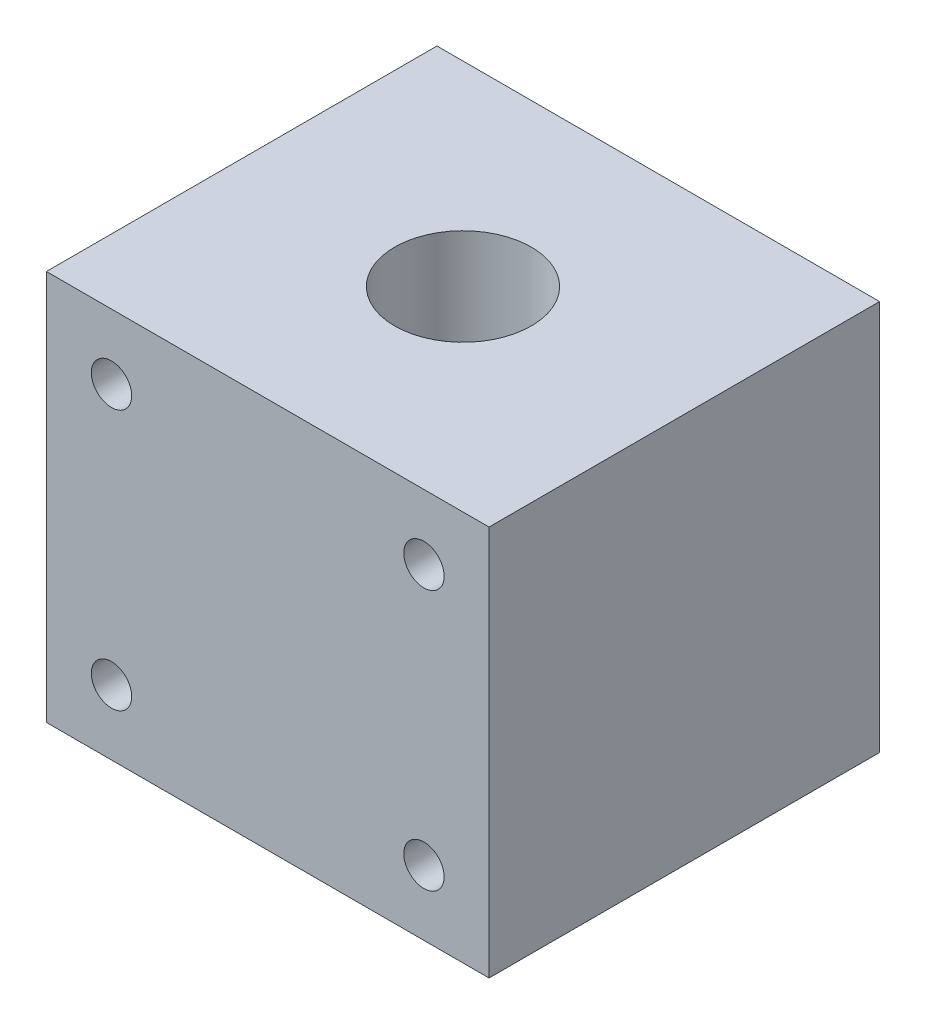
ISO-10303-21;
HEADER;
FILE_DESCRIPTION(('STEP AP214'),'2;1');
FILE_NAME('part.step','',(''),(''),'','','');
FILE_SCHEMA(('AUTOMOTIVE_DESIGN { 1 0 10303 214 1 1 1 1 }'));
ENDSEC;
DATA;
#1=APPLICATION_CONTEXT('core data for automotive mechanical design processes');
#2=APPLICATION_PROTOCOL_DEFINITION('international standard','automotive_design',2000,#1);
#3=PRODUCT_CONTEXT('',#1,'mechanical');
#4=PRODUCT('Part','Part','',(#3));
#5=PRODUCT_RELATED_PRODUCT_CATEGORY('part','',(#4));
#6=PRODUCT_DEFINITION_FORMATION('','',#4);
#7=PRODUCT_DEFINITION_CONTEXT('part definition',#1,'design');
#8=PRODUCT_DEFINITION('design','',#6,#7);
#9=PRODUCT_DEFINITION_SHAPE('','',#8);
#10=(LENGTH_UNIT() NAMED_UNIT(*) SI_UNIT(.MILLI.,.METRE.));
#11=(NAMED_UNIT(*) PLANE_ANGLE_UNIT() SI_UNIT($,.RADIAN.));
#12=(NAMED_UNIT(*) SI_UNIT($,.STERADIAN.) SOLID_ANGLE_UNIT());
#13=UNCERTAINTY_MEASURE_WITH_UNIT(LENGTH_MEASURE(1.E-05),#10,'distance_accuracy_value','');
#14=(GEOMETRIC_REPRESENTATION_CONTEXT(3) GLOBAL_UNCERTAINTY_ASSIGNED_CONTEXT((#13)) GLOBAL_UNIT_ASSIGNED_CONTEXT((#10,
#11,#12)) REPRESENTATION_CONTEXT('',''));
#15=CARTESIAN_POINT('',(0.,0.,0.));
#16=DIRECTION('',(0.,0.,1.));
#17=DIRECTION('',(1.,0.,0.));
#18=AXIS2_PLACEMENT_3D('',#15,#16,#17);
#19=CARTESIAN_POINT('',(0.,30.,0.));
#20=DIRECTION('',(0.,1.,0.));
#21=DIRECTION('',(0.,0.,1.));
#22=AXIS2_PLACEMENT_3D('',#19,#20,#21);
#23=PLANE('',#22);
#24=DIRECTION('',(-1.,0.,0.));
#25=VECTOR('',#24,1.);
#26=CARTESIAN_POINT('',(34.,30.,0.));
#27=LINE('',#26,#25);
#28=CARTESIAN_POINT('',(34.,30.,0.));
#29=VERTEX_POINT('',#28);
#30=CARTESIAN_POINT('',(0.,30.,0.));
#31=VERTEX_POINT('',#30);
#32=EDGE_CURVE('E92',#29,#31,#27,.T.);
#33=ORIENTED_EDGE('',*,*,#32,.T.);
#34=DIRECTION('',(0.,0.,1.));
#35=VECTOR('',#34,1.);
#36=CARTESIAN_POINT('',(0.,30.,0.));
#37=LINE('',#36,#35);
#38=CARTESIAN_POINT('',(0.,30.,30.));
#39=VERTEX_POINT('',#38);
#40=EDGE_CURVE('E87',#31,#39,#37,.T.);
#41=ORIENTED_EDGE('',*,*,#40,.T.);
#42=DIRECTION('',(1.,0.,0.));
#43=VECTOR('',#42,1.);
#44=CARTESIAN_POINT('',(0.,30.,30.));
#45=LINE('',#44,#43);
#46=CARTESIAN_POINT('',(34.,30.,30.));
#47=VERTEX_POINT('',#46);
#48=EDGE_CURVE('E90',#39,#47,#45,.T.);
#49=ORIENTED_EDGE('',*,*,#48,.T.);
#50=DIRECTION('',(0.,0.,-1.));
#51=VECTOR('',#50,1.);
#52=CARTESIAN_POINT('',(34.,30.,30.));
#53=LINE('',#52,#51);
#54=EDGE_CURVE('E57',#47,#29,#53,.T.);
#55=ORIENTED_EDGE('',*,*,#54,.T.);
#56=EDGE_LOOP('',(#33,#41,#49,#55));
#57=FACE_BOUND('',#56,.T.);
#58=CARTESIAN_POINT('',(17.,30.,15.));
#59=DIRECTION('',(0.,1.,0.));
#60=DIRECTION('',(0.,0.,1.));
#61=AXIS2_PLACEMENT_3D('',#58,#59,#60);
#62=CIRCLE('',#61,5.25);
#63=CARTESIAN_POINT('',(17.,30.,20.25));
#64=VERTEX_POINT('',#63);
#65=EDGE_CURVE('E107',#64,#64,#62,.T.);
#66=ORIENTED_EDGE('',*,*,#65,.F.);
#67=EDGE_LOOP('',(#66));
#68=FACE_BOUND('',#67,.T.);
#69=ADVANCED_FACE('F40',(#57,#68),#23,.T.);
#70=CARTESIAN_POINT('',(0.,0.,0.));
#71=DIRECTION('',(0.,1.,0.));
#72=DIRECTION('',(0.,0.,1.));
#73=AXIS2_PLACEMENT_3D('',#70,#71,#72);
#74=PLANE('',#73);
#75=CARTESIAN_POINT('',(17.,0.,23.));
#76=DIRECTION('',(0.,-1.,0.));
#77=DIRECTION('',(0.,0.,-1.));
#78=AXIS2_PLACEMENT_3D('',#75,#76,#77);
#79=CIRCLE('',#78,1.25);
#80=CARTESIAN_POINT('',(17.,0.,21.75));
#81=VERTEX_POINT('',#80);
#82=EDGE_CURVE('E144',#81,#81,#79,.T.);
#83=ORIENTED_EDGE('',*,*,#82,.F.);
#84=EDGE_LOOP('',(#83));
#85=FACE_BOUND('',#84,.T.);
#86=CARTESIAN_POINT('',(25.0000000000001,0.,15.0000000000001));
#87=DIRECTION('',(0.,-1.,0.));
#88=DIRECTION('',(0.,0.,-1.));
#89=AXIS2_PLACEMENT_3D('',#86,#87,#88);
#90=CIRCLE('',#89,1.25);
#91=CARTESIAN_POINT('',(25.0000000000001,0.,13.7500000000001));
#92=VERTEX_POINT('',#91);
#93=EDGE_CURVE('E141',#92,#92,#90,.T.);
#94=ORIENTED_EDGE('',*,*,#93,.F.);
#95=EDGE_LOOP('',(#94));
#96=FACE_BOUND('',#95,.T.);
#97=CARTESIAN_POINT('',(17.0000000000002,0.,7.));
#98=DIRECTION('',(0.,-1.,0.));
#99=DIRECTION('',(0.,0.,-1.));
#100=AXIS2_PLACEMENT_3D('',#97,#98,#99);
#101=CIRCLE('',#100,1.25);
#102=CARTESIAN_POINT('',(17.0000000000002,0.,5.75));
#103=VERTEX_POINT('',#102);
#104=EDGE_CURVE('E135',#103,#103,#101,.T.);
#105=ORIENTED_EDGE('',*,*,#104,.F.);
#106=EDGE_LOOP('',(#105));
#107=FACE_BOUND('',#106,.T.);
#108=CARTESIAN_POINT('',(9.00000000000012,0.,15.));
#109=DIRECTION('',(0.,-1.,0.));
#110=DIRECTION('',(0.,0.,-1.));
#111=AXIS2_PLACEMENT_3D('',#108,#109,#110);
#112=CIRCLE('',#111,1.25);
#113=CARTESIAN_POINT('',(9.00000000000012,0.,13.75));
#114=VERTEX_POINT('',#113);
#115=EDGE_CURVE('E128',#114,#114,#112,.T.);
#116=ORIENTED_EDGE('',*,*,#115,.F.);
#117=EDGE_LOOP('',(#116));
#118=FACE_BOUND('',#117,.T.);
#119=DIRECTION('',(-1.,0.,0.));
#120=VECTOR('',#119,1.);
#121=CARTESIAN_POINT('',(34.,0.,0.));
#122=LINE('',#121,#120);
#123=CARTESIAN_POINT('',(34.,0.,0.));
#124=VERTEX_POINT('',#123);
#125=CARTESIAN_POINT('',(0.,0.,0.));
#126=VERTEX_POINT('',#125);
#127=EDGE_CURVE('E104',#124,#126,#122,.T.);
#128=ORIENTED_EDGE('',*,*,#127,.F.);
#129=DIRECTION('',(0.,0.,-1.));
#130=VECTOR('',#129,1.);
#131=CARTESIAN_POINT('',(34.,0.,30.));
#132=LINE('',#131,#130);
#133=CARTESIAN_POINT('',(34.,0.,30.));
#134=VERTEX_POINT('',#133);
#135=EDGE_CURVE('E80',#134,#124,#132,.T.);
#136=ORIENTED_EDGE('',*,*,#135,.F.);
#137=DIRECTION('',(1.,0.,0.));
#138=VECTOR('',#137,1.);
#139=CARTESIAN_POINT('',(0.,0.,30.));
#140=LINE('',#139,#138);
#141=CARTESIAN_POINT('',(0.,0.,30.));
#142=VERTEX_POINT('',#141);
#143=EDGE_CURVE('E74',#142,#134,#140,.T.);
#144=ORIENTED_EDGE('',*,*,#143,.F.);
#145=DIRECTION('',(0.,0.,1.));
#146=VECTOR('',#145,1.);
#147=CARTESIAN_POINT('',(0.,0.,0.));
#148=LINE('',#147,#146);
#149=EDGE_CURVE('E96',#126,#142,#148,.T.);
#150=ORIENTED_EDGE('',*,*,#149,.F.);
#151=EDGE_LOOP('',(#128,#136,#144,#150));
#152=FACE_BOUND('',#151,.T.);
#153=CARTESIAN_POINT('',(17.,0.,15.));
#154=DIRECTION('',(0.,1.,0.));
#155=DIRECTION('',(0.,0.,1.));
#156=AXIS2_PLACEMENT_3D('',#153,#154,#155);
#157=CIRCLE('',#156,5.25);
#158=CARTESIAN_POINT('',(17.,0.,20.25));
#159=VERTEX_POINT('',#158);
#160=EDGE_CURVE('E119',#159,#159,#157,.T.);
#161=ORIENTED_EDGE('',*,*,#160,.T.);
#162=EDGE_LOOP('',(#161));
#163=FACE_BOUND('',#162,.T.);
#164=ADVANCED_FACE('F115',(#85,#96,#107,#118,#152,#163),#74,.F.);
#165=CARTESIAN_POINT('',(34.,30.,0.));
#166=DIRECTION('',(0.,0.,1.));
#167=DIRECTION('',(1.,0.,0.));
#168=AXIS2_PLACEMENT_3D('',#165,#166,#167);
#169=PLANE('',#168);
#170=ORIENTED_EDGE('',*,*,#127,.T.);
#171=DIRECTION('',(0.,-1.,0.));
#172=VECTOR('',#171,1.);
#173=CARTESIAN_POINT('',(0.,30.,0.));
#174=LINE('',#173,#172);
#175=EDGE_CURVE('E11',#31,#126,#174,.T.);
#176=ORIENTED_EDGE('',*,*,#175,.F.);
#177=ORIENTED_EDGE('',*,*,#32,.F.);
#178=DIRECTION('',(0.,-1.,0.));
#179=VECTOR('',#178,1.);
#180=CARTESIAN_POINT('',(34.,30.,0.));
#181=LINE('',#180,#179);
#182=EDGE_CURVE('E100',#29,#124,#181,.T.);
#183=ORIENTED_EDGE('',*,*,#182,.T.);
#184=EDGE_LOOP('',(#170,#176,#177,#183));
#185=FACE_BOUND('',#184,.T.);
#186=ADVANCED_FACE('F42',(#185),#169,.F.);
#187=CARTESIAN_POINT('',(0.,30.,0.));
#188=DIRECTION('',(1.,0.,0.));
#189=DIRECTION('',(0.,0.,-1.));
#190=AXIS2_PLACEMENT_3D('',#187,#188,#189);
#191=PLANE('',#190);
#192=ORIENTED_EDGE('',*,*,#149,.T.);
#193=DIRECTION('',(0.,-1.,0.));
#194=VECTOR('',#193,1.);
#195=CARTESIAN_POINT('',(0.,30.,30.));
#196=LINE('',#195,#194);
#197=EDGE_CURVE('E49',#39,#142,#196,.T.);
#198=ORIENTED_EDGE('',*,*,#197,.F.);
#199=ORIENTED_EDGE('',*,*,#40,.F.);
#200=ORIENTED_EDGE('',*,*,#175,.T.);
#201=EDGE_LOOP('',(#192,#198,#199,#200));
#202=FACE_BOUND('',#201,.T.);
#203=ADVANCED_FACE('F95',(#202),#191,.F.);
#204=CARTESIAN_POINT('',(0.,30.,30.));
#205=DIRECTION('',(0.,0.,-1.));
#206=DIRECTION('',(-1.,0.,0.));
#207=AXIS2_PLACEMENT_3D('',#204,#205,#206);
#208=PLANE('',#207);
#209=CARTESIAN_POINT('',(5.00000000000021,5.,30.));
#210=DIRECTION('',(0.,0.,1.));
#211=DIRECTION('',(1.,0.,0.));
#212=AXIS2_PLACEMENT_3D('',#209,#210,#211);
#213=CIRCLE('',#212,1.55);
#214=CARTESIAN_POINT('',(6.55000000000021,5.,30.));
#215=VERTEX_POINT('',#214);
#216=EDGE_CURVE('E155',#215,#215,#213,.T.);
#217=ORIENTED_EDGE('',*,*,#216,.F.);
#218=EDGE_LOOP('',(#217));
#219=FACE_BOUND('',#218,.T.);
#220=CARTESIAN_POINT('',(29.0000000000002,5.,30.));
#221=DIRECTION('',(0.,0.,1.));
#222=DIRECTION('',(1.,0.,0.));
#223=AXIS2_PLACEMENT_3D('',#220,#221,#222);
#224=CIRCLE('',#223,1.55);
#225=CARTESIAN_POINT('',(30.5500000000002,5.,30.));
#226=VERTEX_POINT('',#225);
#227=EDGE_CURVE('E161',#226,#226,#224,.T.);
#228=ORIENTED_EDGE('',*,*,#227,.F.);
#229=EDGE_LOOP('',(#228));
#230=FACE_BOUND('',#229,.T.);
#231=CARTESIAN_POINT('',(29.,25.,30.));
#232=DIRECTION('',(0.,0.,1.));
#233=DIRECTION('',(1.,0.,0.));
#234=AXIS2_PLACEMENT_3D('',#231,#232,#233);
#235=CIRCLE('',#234,1.55);
#236=CARTESIAN_POINT('',(30.55,25.,30.));
#237=VERTEX_POINT('',#236);
#238=EDGE_CURVE('E167',#237,#237,#235,.T.);
#239=ORIENTED_EDGE('',*,*,#238,.F.);
#240=EDGE_LOOP('',(#239));
#241=FACE_BOUND('',#240,.T.);
#242=CARTESIAN_POINT('',(5.,25.,30.));
#243=DIRECTION('',(0.,0.,1.));
#244=DIRECTION('',(1.,0.,0.));
#245=AXIS2_PLACEMENT_3D('',#242,#243,#244);
#246=CIRCLE('',#245,1.55);
#247=CARTESIAN_POINT('',(6.55,25.,30.));
#248=VERTEX_POINT('',#247);
#249=EDGE_CURVE('E149',#248,#248,#246,.T.);
#250=ORIENTED_EDGE('',*,*,#249,.F.);
#251=EDGE_LOOP('',(#250));
#252=FACE_BOUND('',#251,.T.);
#253=ORIENTED_EDGE('',*,*,#143,.T.);
#254=DIRECTION('',(0.,-1.,0.));
#255=VECTOR('',#254,1.);
#256=CARTESIAN_POINT('',(34.,30.,30.));
#257=LINE('',#256,#255);
#258=EDGE_CURVE('E97',#47,#134,#257,.T.);
#259=ORIENTED_EDGE('',*,*,#258,.F.);
#260=ORIENTED_EDGE('',*,*,#48,.F.);
#261=ORIENTED_EDGE('',*,*,#197,.T.);
#262=EDGE_LOOP('',(#253,#259,#260,#261));
#263=FACE_BOUND('',#262,.T.);
#264=ADVANCED_FACE('F98',(#219,#230,#241,#252,#263),#208,.F.);
#265=CARTESIAN_POINT('',(34.,30.,30.));
#266=DIRECTION('',(-1.,0.,0.));
#267=DIRECTION('',(0.,0.,1.));
#268=AXIS2_PLACEMENT_3D('',#265,#266,#267);
#269=PLANE('',#268);
#270=ORIENTED_EDGE('',*,*,#135,.T.);
#271=ORIENTED_EDGE('',*,*,#182,.F.);
#272=ORIENTED_EDGE('',*,*,#54,.F.);
#273=ORIENTED_EDGE('',*,*,#258,.T.);
#274=EDGE_LOOP('',(#270,#271,#272,#273));
#275=FACE_BOUND('',#274,.T.);
#276=ADVANCED_FACE('F112',(#275),#269,.F.);
#277=CARTESIAN_POINT('',(17.,30.,15.));
#278=DIRECTION('',(0.,-1.,0.));
#279=DIRECTION('',(0.,0.,-1.));
#280=AXIS2_PLACEMENT_3D('',#277,#278,#279);
#281=CYLINDRICAL_SURFACE('',#280,5.25);
#282=ORIENTED_EDGE('',*,*,#65,.T.);
#283=EDGE_LOOP('',(#282));
#284=FACE_BOUND('',#283,.T.);
#285=ORIENTED_EDGE('',*,*,#160,.F.);
#286=EDGE_LOOP('',(#285));
#287=FACE_BOUND('',#286,.T.);
#288=ADVANCED_FACE('F211',(#284,#287),#281,.F.);
#289=CARTESIAN_POINT('',(9.00000000000012,10.,15.));
#290=DIRECTION('',(0.,-1.,0.));
#291=DIRECTION('',(0.,0.,-1.));
#292=AXIS2_PLACEMENT_3D('',#289,#290,#291);
#293=CYLINDRICAL_SURFACE('',#292,1.25);
#294=CARTESIAN_POINT('',(9.00000000000012,10.,15.));
#295=DIRECTION('',(0.,-1.,0.));
#296=DIRECTION('',(0.,0.,-1.));
#297=AXIS2_PLACEMENT_3D('',#294,#295,#296);
#298=CIRCLE('',#297,1.25);
#299=CARTESIAN_POINT('',(9.00000000000012,10.,13.75));
#300=VERTEX_POINT('',#299);
#301=EDGE_CURVE('E125',#300,#300,#298,.T.);
#302=ORIENTED_EDGE('',*,*,#301,.F.);
#303=EDGE_LOOP('',(#302));
#304=FACE_BOUND('',#303,.T.);
#305=ORIENTED_EDGE('',*,*,#115,.T.);
#306=EDGE_LOOP('',(#305));
#307=FACE_BOUND('',#306,.T.);
#308=ADVANCED_FACE('F236',(#304,#307),#293,.F.);
#309=CARTESIAN_POINT('',(9.00000000000012,10.,15.));
#310=DIRECTION('',(0.,-1.,0.));
#311=DIRECTION('',(0.,0.,-1.));
#312=AXIS2_PLACEMENT_3D('',#309,#310,#311);
#313=PLANE('',#312);
#314=ORIENTED_EDGE('',*,*,#301,.T.);
#315=EDGE_LOOP('',(#314));
#316=FACE_BOUND('',#315,.T.);
#317=ADVANCED_FACE('F242',(#316),#313,.T.);
#318=CARTESIAN_POINT('',(17.0000000000002,10.,7.));
#319=DIRECTION('',(0.,-1.,0.));
#320=DIRECTION('',(0.,0.,-1.));
#321=AXIS2_PLACEMENT_3D('',#318,#319,#320);
#322=CYLINDRICAL_SURFACE('',#321,1.25);
#323=CARTESIAN_POINT('',(17.0000000000002,10.,7.));
#324=DIRECTION('',(0.,-1.,0.));
#325=DIRECTION('',(0.,0.,-1.));
#326=AXIS2_PLACEMENT_3D('',#323,#324,#325);
#327=CIRCLE('',#326,1.25);
#328=CARTESIAN_POINT('',(17.0000000000002,10.,5.75));
#329=VERTEX_POINT('',#328);
#330=EDGE_CURVE('E132',#329,#329,#327,.T.);
#331=ORIENTED_EDGE('',*,*,#330,.F.);
#332=EDGE_LOOP('',(#331));
#333=FACE_BOUND('',#332,.T.);
#334=ORIENTED_EDGE('',*,*,#104,.T.);
#335=EDGE_LOOP('',(#334));
#336=FACE_BOUND('',#335,.T.);
#337=ADVANCED_FACE('F232',(#333,#336),#322,.F.);
#338=CARTESIAN_POINT('',(17.0000000000002,10.,7.));
#339=DIRECTION('',(0.,-1.,0.));
#340=DIRECTION('',(0.,0.,-1.));
#341=AXIS2_PLACEMENT_3D('',#338,#339,#340);
#342=PLANE('',#341);
#343=ORIENTED_EDGE('',*,*,#330,.T.);
#344=EDGE_LOOP('',(#343));
#345=FACE_BOUND('',#344,.T.);
#346=ADVANCED_FACE('F264',(#345),#342,.T.);
#347=CARTESIAN_POINT('',(25.0000000000001,10.,15.0000000000001));
#348=DIRECTION('',(0.,-1.,0.));
#349=DIRECTION('',(0.,0.,-1.));
#350=AXIS2_PLACEMENT_3D('',#347,#348,#349);
#351=CYLINDRICAL_SURFACE('',#350,1.25);
#352=CARTESIAN_POINT('',(25.0000000000001,10.,15.0000000000001));
#353=DIRECTION('',(0.,-1.,0.));
#354=DIRECTION('',(0.,0.,-1.));
#355=AXIS2_PLACEMENT_3D('',#352,#353,#354);
#356=CIRCLE('',#355,1.25);
#357=CARTESIAN_POINT('',(25.0000000000001,10.,13.7500000000001));
#358=VERTEX_POINT('',#357);
#359=EDGE_CURVE('E138',#358,#358,#356,.T.);
#360=ORIENTED_EDGE('',*,*,#359,.F.);
#361=EDGE_LOOP('',(#360));
#362=FACE_BOUND('',#361,.T.);
#363=ORIENTED_EDGE('',*,*,#93,.T.);
#364=EDGE_LOOP('',(#363));
#365=FACE_BOUND('',#364,.T.);
#366=ADVANCED_FACE('F261',(#362,#365),#351,.F.);
#367=CARTESIAN_POINT('',(25.0000000000001,10.,15.0000000000001));
#368=DIRECTION('',(0.,-1.,0.));
#369=DIRECTION('',(0.,0.,-1.));
#370=AXIS2_PLACEMENT_3D('',#367,#368,#369);
#371=PLANE('',#370);
#372=ORIENTED_EDGE('',*,*,#359,.T.);
#373=EDGE_LOOP('',(#372));
#374=FACE_BOUND('',#373,.T.);
#375=ADVANCED_FACE('F254',(#374),#371,.T.);
#376=CARTESIAN_POINT('',(17.,10.,23.));
#377=DIRECTION('',(0.,-1.,0.));
#378=DIRECTION('',(0.,0.,-1.));
#379=AXIS2_PLACEMENT_3D('',#376,#377,#378);
#380=CYLINDRICAL_SURFACE('',#379,1.25);
#381=CARTESIAN_POINT('',(17.,10.,23.));
#382=DIRECTION('',(0.,-1.,0.));
#383=DIRECTION('',(0.,0.,-1.));
#384=AXIS2_PLACEMENT_3D('',#381,#382,#383);
#385=CIRCLE('',#384,1.25);
#386=CARTESIAN_POINT('',(17.,10.,21.75));
#387=VERTEX_POINT('',#386);
#388=EDGE_CURVE('E122',#387,#387,#385,.T.);
#389=ORIENTED_EDGE('',*,*,#388,.F.);
#390=EDGE_LOOP('',(#389));
#391=FACE_BOUND('',#390,.T.);
#392=ORIENTED_EDGE('',*,*,#82,.T.);
#393=EDGE_LOOP('',(#392));
#394=FACE_BOUND('',#393,.T.);
#395=ADVANCED_FACE('F199',(#391,#394),#380,.F.);
#396=CARTESIAN_POINT('',(17.,10.,23.));
#397=DIRECTION('',(0.,-1.,0.));
#398=DIRECTION('',(0.,0.,-1.));
#399=AXIS2_PLACEMENT_3D('',#396,#397,#398);
#400=PLANE('',#399);
#401=ORIENTED_EDGE('',*,*,#388,.T.);
#402=EDGE_LOOP('',(#401));
#403=FACE_BOUND('',#402,.T.);
#404=ADVANCED_FACE('F190',(#403),#400,.T.);
#405=CARTESIAN_POINT('',(5.,25.,20.));
#406=DIRECTION('',(0.,0.,1.));
#407=DIRECTION('',(1.,0.,0.));
#408=AXIS2_PLACEMENT_3D('',#405,#406,#407);
#409=CYLINDRICAL_SURFACE('',#408,1.55);
#410=CARTESIAN_POINT('',(5.,25.,20.));
#411=DIRECTION('',(0.,0.,1.));
#412=DIRECTION('',(1.,0.,0.));
#413=AXIS2_PLACEMENT_3D('',#410,#411,#412);
#414=CIRCLE('',#413,1.55);
#415=CARTESIAN_POINT('',(6.55,25.,20.));
#416=VERTEX_POINT('',#415);
#417=EDGE_CURVE('E129',#416,#416,#414,.T.);
#418=ORIENTED_EDGE('',*,*,#417,.F.);
#419=EDGE_LOOP('',(#418));
#420=FACE_BOUND('',#419,.T.);
#421=ORIENTED_EDGE('',*,*,#249,.T.);
#422=EDGE_LOOP('',(#421));
#423=FACE_BOUND('',#422,.T.);
#424=ADVANCED_FACE('F188',(#420,#423),#409,.F.);
#425=CARTESIAN_POINT('',(5.,25.,20.));
#426=DIRECTION('',(0.,0.,1.));
#427=DIRECTION('',(1.,0.,0.));
#428=AXIS2_PLACEMENT_3D('',#425,#426,#427);
#429=PLANE('',#428);
#430=ORIENTED_EDGE('',*,*,#417,.T.);
#431=EDGE_LOOP('',(#430));
#432=FACE_BOUND('',#431,.T.);
#433=ADVANCED_FACE('F178',(#432),#429,.T.);
#434=CARTESIAN_POINT('',(29.,25.,20.));
#435=DIRECTION('',(0.,0.,1.));
#436=DIRECTION('',(1.,0.,0.));
#437=AXIS2_PLACEMENT_3D('',#434,#435,#436);
#438=CYLINDRICAL_SURFACE('',#437,1.55);
#439=CARTESIAN_POINT('',(29.,25.,20.));
#440=DIRECTION('',(0.,0.,1.));
#441=DIRECTION('',(1.,0.,0.));
#442=AXIS2_PLACEMENT_3D('',#439,#440,#441);
#443=CIRCLE('',#442,1.55);
#444=CARTESIAN_POINT('',(30.55,25.,20.));
#445=VERTEX_POINT('',#444);
#446=EDGE_CURVE('E152',#445,#445,#443,.T.);
#447=ORIENTED_EDGE('',*,*,#446,.F.);
#448=EDGE_LOOP('',(#447));
#449=FACE_BOUND('',#448,.T.);
#450=ORIENTED_EDGE('',*,*,#238,.T.);
#451=EDGE_LOOP('',(#450));
#452=FACE_BOUND('',#451,.T.);
#453=ADVANCED_FACE('F175',(#449,#452),#438,.F.);
#454=CARTESIAN_POINT('',(29.,25.,20.));
#455=DIRECTION('',(0.,0.,1.));
#456=DIRECTION('',(1.,0.,0.));
#457=AXIS2_PLACEMENT_3D('',#454,#455,#456);
#458=PLANE('',#457);
#459=ORIENTED_EDGE('',*,*,#446,.T.);
#460=EDGE_LOOP('',(#459));
#461=FACE_BOUND('',#460,.T.);
#462=ADVANCED_FACE('F173',(#461),#458,.T.);
#463=CARTESIAN_POINT('',(29.0000000000002,5.,20.));
#464=DIRECTION('',(0.,0.,1.));
#465=DIRECTION('',(1.,0.,0.));
#466=AXIS2_PLACEMENT_3D('',#463,#464,#465);
#467=CYLINDRICAL_SURFACE('',#466,1.55);
#468=CARTESIAN_POINT('',(29.0000000000002,5.,20.));
#469=DIRECTION('',(0.,0.,1.));
#470=DIRECTION('',(1.,0.,0.));
#471=AXIS2_PLACEMENT_3D('',#468,#469,#470);
#472=CIRCLE('',#471,1.55);
#473=CARTESIAN_POINT('',(30.5500000000002,5.,20.));
#474=VERTEX_POINT('',#473);
#475=EDGE_CURVE('E164',#474,#474,#472,.T.);
#476=ORIENTED_EDGE('',*,*,#475,.F.);
#477=EDGE_LOOP('',(#476));
#478=FACE_BOUND('',#477,.T.);
#479=ORIENTED_EDGE('',*,*,#227,.T.);
#480=EDGE_LOOP('',(#479));
#481=FACE_BOUND('',#480,.T.);
#482=ADVANCED_FACE('F305',(#478,#481),#467,.F.);
#483=CARTESIAN_POINT('',(29.0000000000002,5.,20.));
#484=DIRECTION('',(0.,0.,1.));
#485=DIRECTION('',(1.,0.,0.));
#486=AXIS2_PLACEMENT_3D('',#483,#484,#485);
#487=PLANE('',#486);
#488=ORIENTED_EDGE('',*,*,#475,.T.);
#489=EDGE_LOOP('',(#488));
#490=FACE_BOUND('',#489,.T.);
#491=ADVANCED_FACE('F309',(#490),#487,.T.);
#492=CARTESIAN_POINT('',(5.00000000000021,5.,20.));
#493=DIRECTION('',(0.,0.,1.));
#494=DIRECTION('',(1.,0.,0.));
#495=AXIS2_PLACEMENT_3D('',#492,#493,#494);
#496=CYLINDRICAL_SURFACE('',#495,1.55);
#497=CARTESIAN_POINT('',(5.00000000000021,5.,20.));
#498=DIRECTION('',(0.,0.,1.));
#499=DIRECTION('',(1.,0.,0.));
#500=AXIS2_PLACEMENT_3D('',#497,#498,#499);
#501=CIRCLE('',#500,1.55);
#502=CARTESIAN_POINT('',(6.55000000000021,5.,20.));
#503=VERTEX_POINT('',#502);
#504=EDGE_CURVE('E158',#503,#503,#501,.T.);
#505=ORIENTED_EDGE('',*,*,#504,.F.);
#506=EDGE_LOOP('',(#505));
#507=FACE_BOUND('',#506,.T.);
#508=ORIENTED_EDGE('',*,*,#216,.T.);
#509=EDGE_LOOP('',(#508));
#510=FACE_BOUND('',#509,.T.);
#511=ADVANCED_FACE('F317',(#507,#510),#496,.F.);
#512=CARTESIAN_POINT('',(5.00000000000021,5.,20.));
#513=DIRECTION('',(0.,0.,1.));
#514=DIRECTION('',(1.,0.,0.));
#515=AXIS2_PLACEMENT_3D('',#512,#513,#514);
#516=PLANE('',#515);
#517=ORIENTED_EDGE('',*,*,#504,.T.);
#518=EDGE_LOOP('',(#517));
#519=FACE_BOUND('',#518,.T.);
#520=ADVANCED_FACE('F320',(#519),#516,.T.);
#521=CLOSED_SHELL('',(#69,#164,#186,#203,#264,#276,#288,#308,#317,#337,#346,#366,#375,#395,#404,
#424,#433,#453,#462,#482,#491,#511,#520));
#522=MANIFOLD_SOLID_BREP('B2',#521);
#523=ADVANCED_BREP_SHAPE_REPRESENTATION('',(#18,#522),#14);
#524=SHAPE_DEFINITION_REPRESENTATION(#9,#523);
ENDSEC;
END-ISO-10303-21;
